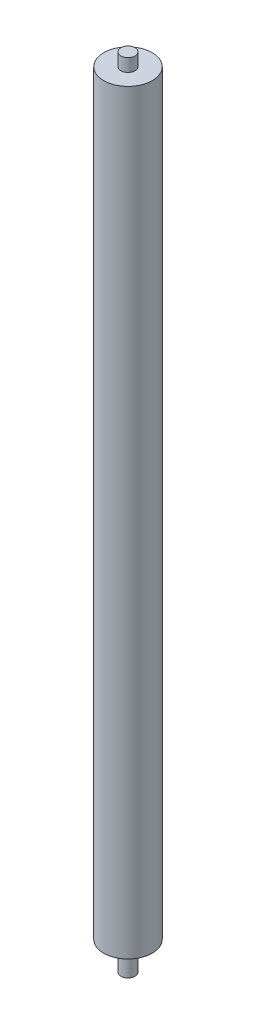
ISO-10303-21;
HEADER;
FILE_DESCRIPTION(('STEP AP214'),'2;1');
FILE_NAME('part.step','',(''),(''),'','','');
FILE_SCHEMA(('AUTOMOTIVE_DESIGN { 1 0 10303 214 1 1 1 1 }'));
ENDSEC;
DATA;
#1=APPLICATION_CONTEXT('core data for automotive mechanical design processes');
#2=APPLICATION_PROTOCOL_DEFINITION('international standard','automotive_design',2000,#1);
#3=PRODUCT_CONTEXT('',#1,'mechanical');
#4=PRODUCT('Part','Part','',(#3));
#5=PRODUCT_RELATED_PRODUCT_CATEGORY('part','',(#4));
#6=PRODUCT_DEFINITION_FORMATION('','',#4);
#7=PRODUCT_DEFINITION_CONTEXT('part definition',#1,'design');
#8=PRODUCT_DEFINITION('design','',#6,#7);
#9=PRODUCT_DEFINITION_SHAPE('','',#8);
#10=(LENGTH_UNIT() NAMED_UNIT(*) SI_UNIT(.MILLI.,.METRE.));
#11=(NAMED_UNIT(*) PLANE_ANGLE_UNIT() SI_UNIT($,.RADIAN.));
#12=(NAMED_UNIT(*) SI_UNIT($,.STERADIAN.) SOLID_ANGLE_UNIT());
#13=UNCERTAINTY_MEASURE_WITH_UNIT(LENGTH_MEASURE(1.E-05),#10,'distance_accuracy_value','');
#14=(GEOMETRIC_REPRESENTATION_CONTEXT(3) GLOBAL_UNCERTAINTY_ASSIGNED_CONTEXT((#13)) GLOBAL_UNIT_ASSIGNED_CONTEXT((#10,
#11,#12)) REPRESENTATION_CONTEXT('',''));
#15=CARTESIAN_POINT('',(0.,0.,0.));
#16=DIRECTION('',(0.,0.,1.));
#17=DIRECTION('',(1.,0.,0.));
#18=AXIS2_PLACEMENT_3D('',#15,#16,#17);
#19=CARTESIAN_POINT('',(0.,40.,0.));
#20=DIRECTION('',(0.,-1.,0.));
#21=DIRECTION('',(0.,0.,-1.));
#22=AXIS2_PLACEMENT_3D('',#19,#20,#21);
#23=CYLINDRICAL_SURFACE('',#22,10.);
#24=CARTESIAN_POINT('',(0.,40.,0.));
#25=DIRECTION('',(0.,1.,0.));
#26=DIRECTION('',(0.,0.,1.));
#27=AXIS2_PLACEMENT_3D('',#24,#25,#26);
#28=CIRCLE('',#27,10.);
#29=CARTESIAN_POINT('',(0.,40.,10.));
#30=VERTEX_POINT('',#29);
#31=EDGE_CURVE('E39',#30,#30,#28,.T.);
#32=ORIENTED_EDGE('',*,*,#31,.F.);
#33=EDGE_LOOP('',(#32));
#34=FACE_BOUND('',#33,.T.);
#35=CARTESIAN_POINT('',(0.,0.,0.));
#36=DIRECTION('',(0.,1.,0.));
#37=DIRECTION('',(0.,0.,1.));
#38=AXIS2_PLACEMENT_3D('',#35,#36,#37);
#39=CIRCLE('',#38,10.);
#40=CARTESIAN_POINT('',(0.,0.,10.));
#41=VERTEX_POINT('',#40);
#42=EDGE_CURVE('E35',#41,#41,#39,.T.);
#43=ORIENTED_EDGE('',*,*,#42,.T.);
#44=EDGE_LOOP('',(#43));
#45=FACE_BOUND('',#44,.T.);
#46=ADVANCED_FACE('F32',(#34,#45),#23,.T.);
#47=CARTESIAN_POINT('',(0.,0.,0.));
#48=DIRECTION('',(0.,1.,0.));
#49=DIRECTION('',(0.,0.,1.));
#50=AXIS2_PLACEMENT_3D('',#47,#48,#49);
#51=PLANE('',#50);
#52=ORIENTED_EDGE('',*,*,#42,.F.);
#53=EDGE_LOOP('',(#52));
#54=FACE_BOUND('',#53,.T.);
#55=ADVANCED_FACE('F73',(#54),#51,.F.);
#56=CARTESIAN_POINT('',(0.,1100.,0.));
#57=DIRECTION('',(0.,-1.,0.));
#58=DIRECTION('',(0.,0.,-1.));
#59=AXIS2_PLACEMENT_3D('',#56,#57,#58);
#60=CYLINDRICAL_SURFACE('',#59,34.);
#61=CARTESIAN_POINT('',(0.,1100.,0.));
#62=DIRECTION('',(0.,1.,0.));
#63=DIRECTION('',(0.,0.,1.));
#64=AXIS2_PLACEMENT_3D('',#61,#62,#63);
#65=CIRCLE('',#64,34.);
#66=CARTESIAN_POINT('',(0.,1100.,34.));
#67=VERTEX_POINT('',#66);
#68=EDGE_CURVE('E47',#67,#67,#65,.T.);
#69=ORIENTED_EDGE('',*,*,#68,.F.);
#70=EDGE_LOOP('',(#69));
#71=FACE_BOUND('',#70,.T.);
#72=CARTESIAN_POINT('',(0.,40.,0.));
#73=DIRECTION('',(0.,1.,0.));
#74=DIRECTION('',(0.,0.,1.));
#75=AXIS2_PLACEMENT_3D('',#72,#73,#74);
#76=CIRCLE('',#75,34.);
#77=CARTESIAN_POINT('',(0.,40.,34.));
#78=VERTEX_POINT('',#77);
#79=EDGE_CURVE('E50',#78,#78,#76,.T.);
#80=ORIENTED_EDGE('',*,*,#79,.T.);
#81=EDGE_LOOP('',(#80));
#82=FACE_BOUND('',#81,.T.);
#83=ADVANCED_FACE('F78',(#71,#82),#60,.T.);
#84=CARTESIAN_POINT('',(0.,1100.,0.));
#85=DIRECTION('',(0.,1.,0.));
#86=DIRECTION('',(0.,0.,1.));
#87=AXIS2_PLACEMENT_3D('',#84,#85,#86);
#88=PLANE('',#87);
#89=CARTESIAN_POINT('',(0.,1100.,0.));
#90=DIRECTION('',(0.,1.,0.));
#91=DIRECTION('',(0.,0.,1.));
#92=AXIS2_PLACEMENT_3D('',#89,#90,#91);
#93=CIRCLE('',#92,10.);
#94=CARTESIAN_POINT('',(0.,1100.,10.));
#95=VERTEX_POINT('',#94);
#96=EDGE_CURVE('E10',#95,#95,#93,.T.);
#97=ORIENTED_EDGE('',*,*,#96,.F.);
#98=EDGE_LOOP('',(#97));
#99=FACE_BOUND('',#98,.T.);
#100=ORIENTED_EDGE('',*,*,#68,.T.);
#101=EDGE_LOOP('',(#100));
#102=FACE_BOUND('',#101,.T.);
#103=ADVANCED_FACE('F68',(#99,#102),#88,.T.);
#104=CARTESIAN_POINT('',(0.,40.,0.));
#105=DIRECTION('',(0.,1.,0.));
#106=DIRECTION('',(0.,0.,1.));
#107=AXIS2_PLACEMENT_3D('',#104,#105,#106);
#108=PLANE('',#107);
#109=ORIENTED_EDGE('',*,*,#31,.T.);
#110=EDGE_LOOP('',(#109));
#111=FACE_BOUND('',#110,.T.);
#112=ORIENTED_EDGE('',*,*,#79,.F.);
#113=EDGE_LOOP('',(#112));
#114=FACE_BOUND('',#113,.T.);
#115=ADVANCED_FACE('F61',(#111,#114),#108,.F.);
#116=CARTESIAN_POINT('',(0.,1118.,0.));
#117=DIRECTION('',(0.,-1.,0.));
#118=DIRECTION('',(0.,0.,-1.));
#119=AXIS2_PLACEMENT_3D('',#116,#117,#118);
#120=CYLINDRICAL_SURFACE('',#119,10.);
#121=CARTESIAN_POINT('',(0.,1118.,0.));
#122=DIRECTION('',(0.,1.,0.));
#123=DIRECTION('',(0.,0.,1.));
#124=AXIS2_PLACEMENT_3D('',#121,#122,#123);
#125=CIRCLE('',#124,10.);
#126=CARTESIAN_POINT('',(0.,1118.,10.));
#127=VERTEX_POINT('',#126);
#128=EDGE_CURVE('E46',#127,#127,#125,.T.);
#129=ORIENTED_EDGE('',*,*,#128,.F.);
#130=EDGE_LOOP('',(#129));
#131=FACE_BOUND('',#130,.T.);
#132=ORIENTED_EDGE('',*,*,#96,.T.);
#133=EDGE_LOOP('',(#132));
#134=FACE_BOUND('',#133,.T.);
#135=ADVANCED_FACE('F59',(#131,#134),#120,.T.);
#136=CARTESIAN_POINT('',(0.,1118.,0.));
#137=DIRECTION('',(0.,1.,0.));
#138=DIRECTION('',(0.,0.,1.));
#139=AXIS2_PLACEMENT_3D('',#136,#137,#138);
#140=PLANE('',#139);
#141=ORIENTED_EDGE('',*,*,#128,.T.);
#142=EDGE_LOOP('',(#141));
#143=FACE_BOUND('',#142,.T.);
#144=ADVANCED_FACE('F57',(#143),#140,.T.);
#145=CLOSED_SHELL('',(#46,#55,#83,#103,#115,#135,#144));
#146=MANIFOLD_SOLID_BREP('B2',#145);
#147=ADVANCED_BREP_SHAPE_REPRESENTATION('',(#18,#146),#14);
#148=SHAPE_DEFINITION_REPRESENTATION(#9,#147);
ENDSEC;
END-ISO-10303-21;
